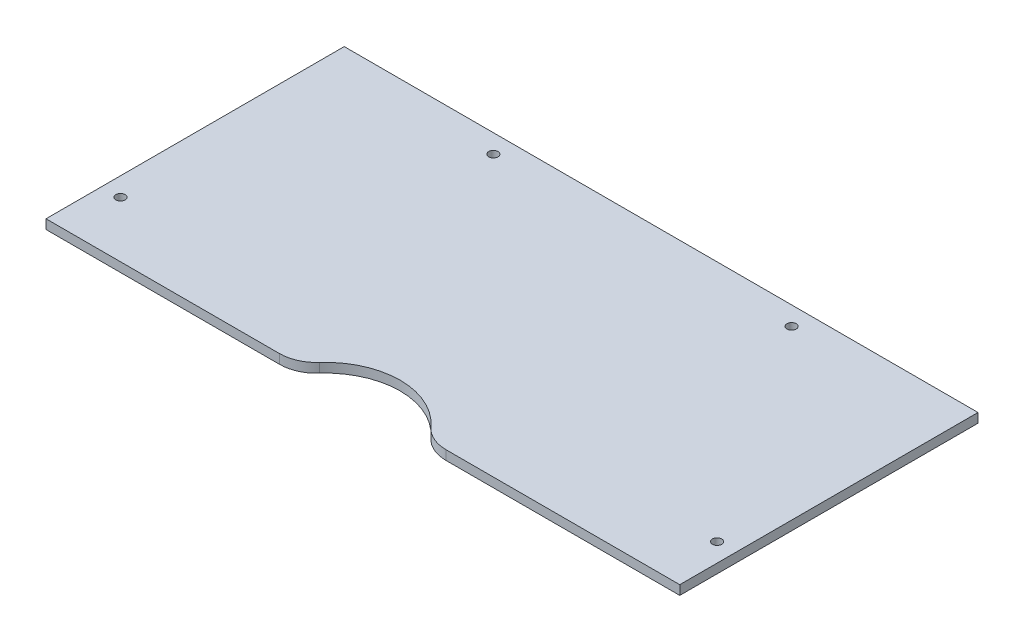
ISO-10303-21;
HEADER;
FILE_DESCRIPTION(('STEP AP214'),'2;1');
FILE_NAME('part.step','',(''),(''),'','','');
FILE_SCHEMA(('AUTOMOTIVE_DESIGN { 1 0 10303 214 1 1 1 1 }'));
ENDSEC;
DATA;
#1=APPLICATION_CONTEXT('core data for automotive mechanical design processes');
#2=APPLICATION_PROTOCOL_DEFINITION('international standard','automotive_design',2000,#1);
#3=PRODUCT_CONTEXT('',#1,'mechanical');
#4=PRODUCT('Part','Part','',(#3));
#5=PRODUCT_RELATED_PRODUCT_CATEGORY('part','',(#4));
#6=PRODUCT_DEFINITION_FORMATION('','',#4);
#7=PRODUCT_DEFINITION_CONTEXT('part definition',#1,'design');
#8=PRODUCT_DEFINITION('design','',#6,#7);
#9=PRODUCT_DEFINITION_SHAPE('','',#8);
#10=(LENGTH_UNIT() NAMED_UNIT(*) SI_UNIT(.MILLI.,.METRE.));
#11=(NAMED_UNIT(*) PLANE_ANGLE_UNIT() SI_UNIT($,.RADIAN.));
#12=(NAMED_UNIT(*) SI_UNIT($,.STERADIAN.) SOLID_ANGLE_UNIT());
#13=UNCERTAINTY_MEASURE_WITH_UNIT(LENGTH_MEASURE(1.E-05),#10,'distance_accuracy_value','');
#14=(GEOMETRIC_REPRESENTATION_CONTEXT(3) GLOBAL_UNCERTAINTY_ASSIGNED_CONTEXT((#13)) GLOBAL_UNIT_ASSIGNED_CONTEXT((#10,
#11,#12)) REPRESENTATION_CONTEXT('',''));
#15=CARTESIAN_POINT('',(0.,0.,0.));
#16=DIRECTION('',(0.,0.,1.));
#17=DIRECTION('',(1.,0.,0.));
#18=AXIS2_PLACEMENT_3D('',#15,#16,#17);
#19=CARTESIAN_POINT('',(107.95,3.175,-114.3));
#20=DIRECTION('',(0.,-1.,0.));
#21=DIRECTION('',(0.,0.,-1.));
#22=AXIS2_PLACEMENT_3D('',#19,#20,#21);
#23=CYLINDRICAL_SURFACE('',#22,25.4);
#24=CARTESIAN_POINT('',(107.95,0.,-114.3));
#25=DIRECTION('',(0.,1.,0.));
#26=DIRECTION('',(0.,0.,1.));
#27=AXIS2_PLACEMENT_3D('',#24,#25,#26);
#28=CIRCLE('',#27,25.4);
#29=CARTESIAN_POINT('',(126.882042209498,0.,-131.233333333333));
#30=VERTEX_POINT('',#29);
#31=CARTESIAN_POINT('',(89.0179577905017,0.,-131.233333333333));
#32=VERTEX_POINT('',#31);
#33=EDGE_CURVE('E158',#30,#32,#28,.T.);
#34=ORIENTED_EDGE('',*,*,#33,.F.);
#35=DIRECTION('',(0.,-1.,0.));
#36=VECTOR('',#35,1.);
#37=CARTESIAN_POINT('',(126.882042209498,3.175,-131.233333333333));
#38=LINE('',#37,#36);
#39=CARTESIAN_POINT('',(126.882042209498,3.175,-131.233333333333));
#40=VERTEX_POINT('',#39);
#41=EDGE_CURVE('E197',#30,#40,#38,.F.);
#42=ORIENTED_EDGE('',*,*,#41,.T.);
#43=CARTESIAN_POINT('',(107.95,3.175,-114.3));
#44=DIRECTION('',(0.,1.,0.));
#45=DIRECTION('',(0.,0.,1.));
#46=AXIS2_PLACEMENT_3D('',#43,#44,#45);
#47=CIRCLE('',#46,25.4);
#48=CARTESIAN_POINT('',(89.0179577905017,3.175,-131.233333333333));
#49=VERTEX_POINT('',#48);
#50=EDGE_CURVE('E141',#40,#49,#47,.T.);
#51=ORIENTED_EDGE('',*,*,#50,.T.);
#52=DIRECTION('',(0.,-1.,0.));
#53=VECTOR('',#52,1.);
#54=CARTESIAN_POINT('',(89.0179577905017,3.175,-131.233333333333));
#55=LINE('',#54,#53);
#56=EDGE_CURVE('E193',#49,#32,#55,.T.);
#57=ORIENTED_EDGE('',*,*,#56,.T.);
#58=EDGE_LOOP('',(#34,#42,#51,#57));
#59=FACE_BOUND('',#58,.T.);
#60=ADVANCED_FACE('F47',(#59),#23,.F.);
#61=CARTESIAN_POINT('',(0.,3.175,-127.));
#62=DIRECTION('',(0.,0.,1.));
#63=DIRECTION('',(1.,0.,0.));
#64=AXIS2_PLACEMENT_3D('',#61,#62,#63);
#65=PLANE('',#64);
#66=DIRECTION('',(-1.,0.,0.));
#67=VECTOR('',#66,1.);
#68=CARTESIAN_POINT('',(0.,3.175,-127.));
#69=LINE('',#68,#67);
#70=CARTESIAN_POINT('',(215.9,3.175,-127.));
#71=VERTEX_POINT('',#70);
#72=CARTESIAN_POINT('',(136.348063314247,3.175,-127.));
#73=VERTEX_POINT('',#72);
#74=EDGE_CURVE('E119',#71,#73,#69,.T.);
#75=ORIENTED_EDGE('',*,*,#74,.T.);
#76=DIRECTION('',(0.,-1.,0.));
#77=VECTOR('',#76,1.);
#78=CARTESIAN_POINT('',(136.348063314247,3.175,-127.));
#79=LINE('',#78,#77);
#80=CARTESIAN_POINT('',(136.348063314247,0.,-127.));
#81=VERTEX_POINT('',#80);
#82=EDGE_CURVE('E127',#73,#81,#79,.T.);
#83=ORIENTED_EDGE('',*,*,#82,.T.);
#84=DIRECTION('',(-1.,0.,0.));
#85=VECTOR('',#84,1.);
#86=CARTESIAN_POINT('',(0.,0.,-127.));
#87=LINE('',#86,#85);
#88=CARTESIAN_POINT('',(215.9,0.,-127.));
#89=VERTEX_POINT('',#88);
#90=EDGE_CURVE('E122',#89,#81,#87,.T.);
#91=ORIENTED_EDGE('',*,*,#90,.F.);
#92=DIRECTION('',(0.,-1.,0.));
#93=VECTOR('',#92,1.);
#94=CARTESIAN_POINT('',(215.9,3.175,-127.));
#95=LINE('',#94,#93);
#96=EDGE_CURVE('E114',#71,#89,#95,.T.);
#97=ORIENTED_EDGE('',*,*,#96,.F.);
#98=EDGE_LOOP('',(#75,#83,#91,#97));
#99=FACE_BOUND('',#98,.T.);
#100=ADVANCED_FACE('F116',(#99),#65,.T.);
#101=CARTESIAN_POINT('',(215.9,3.175,0.));
#102=DIRECTION('',(-1.,0.,0.));
#103=DIRECTION('',(0.,0.,1.));
#104=AXIS2_PLACEMENT_3D('',#101,#102,#103);
#105=PLANE('',#104);
#106=DIRECTION('',(0.,0.,-1.));
#107=VECTOR('',#106,1.);
#108=CARTESIAN_POINT('',(215.9,0.,0.));
#109=LINE('',#108,#107);
#110=CARTESIAN_POINT('',(215.9,0.,-228.6));
#111=VERTEX_POINT('',#110);
#112=EDGE_CURVE('E165',#89,#111,#109,.T.);
#113=ORIENTED_EDGE('',*,*,#112,.T.);
#114=DIRECTION('',(0.,-1.,0.));
#115=VECTOR('',#114,1.);
#116=CARTESIAN_POINT('',(215.9,3.175,-228.6));
#117=LINE('',#116,#115);
#118=CARTESIAN_POINT('',(215.9,3.175,-228.6));
#119=VERTEX_POINT('',#118);
#120=EDGE_CURVE('E128',#119,#111,#117,.T.);
#121=ORIENTED_EDGE('',*,*,#120,.F.);
#122=DIRECTION('',(0.,0.,-1.));
#123=VECTOR('',#122,1.);
#124=CARTESIAN_POINT('',(215.9,3.175,0.));
#125=LINE('',#124,#123);
#126=EDGE_CURVE('E131',#71,#119,#125,.T.);
#127=ORIENTED_EDGE('',*,*,#126,.F.);
#128=ORIENTED_EDGE('',*,*,#96,.T.);
#129=EDGE_LOOP('',(#113,#121,#127,#128));
#130=FACE_BOUND('',#129,.T.);
#131=ADVANCED_FACE('F132',(#130),#105,.F.);
#132=CARTESIAN_POINT('',(0.,3.175,-228.6));
#133=DIRECTION('',(0.,0.,-1.));
#134=DIRECTION('',(-1.,0.,0.));
#135=AXIS2_PLACEMENT_3D('',#132,#133,#134);
#136=PLANE('',#135);
#137=DIRECTION('',(1.,0.,0.));
#138=VECTOR('',#137,1.);
#139=CARTESIAN_POINT('',(0.,0.,-228.6));
#140=LINE('',#139,#138);
#141=CARTESIAN_POINT('',(0.,0.,-228.6));
#142=VERTEX_POINT('',#141);
#143=EDGE_CURVE('E168',#142,#111,#140,.T.);
#144=ORIENTED_EDGE('',*,*,#143,.F.);
#145=DIRECTION('',(0.,-1.,0.));
#146=VECTOR('',#145,1.);
#147=CARTESIAN_POINT('',(0.,3.175,-228.6));
#148=LINE('',#147,#146);
#149=CARTESIAN_POINT('',(0.,3.175,-228.6));
#150=VERTEX_POINT('',#149);
#151=EDGE_CURVE('E180',#150,#142,#148,.T.);
#152=ORIENTED_EDGE('',*,*,#151,.F.);
#153=DIRECTION('',(1.,0.,0.));
#154=VECTOR('',#153,1.);
#155=CARTESIAN_POINT('',(0.,3.175,-228.6));
#156=LINE('',#155,#154);
#157=EDGE_CURVE('E136',#150,#119,#156,.T.);
#158=ORIENTED_EDGE('',*,*,#157,.T.);
#159=ORIENTED_EDGE('',*,*,#120,.T.);
#160=EDGE_LOOP('',(#144,#152,#158,#159));
#161=FACE_BOUND('',#160,.T.);
#162=ADVANCED_FACE('F214',(#161),#136,.T.);
#163=CARTESIAN_POINT('',(0.,3.175,0.));
#164=DIRECTION('',(-1.,0.,0.));
#165=DIRECTION('',(0.,0.,1.));
#166=AXIS2_PLACEMENT_3D('',#163,#164,#165);
#167=PLANE('',#166);
#168=DIRECTION('',(0.,0.,-1.));
#169=VECTOR('',#168,1.);
#170=CARTESIAN_POINT('',(0.,0.,0.));
#171=LINE('',#170,#169);
#172=CARTESIAN_POINT('',(0.,0.,-127.));
#173=VERTEX_POINT('',#172);
#174=EDGE_CURVE('E172',#173,#142,#171,.T.);
#175=ORIENTED_EDGE('',*,*,#174,.F.);
#176=DIRECTION('',(0.,-1.,0.));
#177=VECTOR('',#176,1.);
#178=CARTESIAN_POINT('',(0.,3.175,-127.));
#179=LINE('',#178,#177);
#180=CARTESIAN_POINT('',(0.,3.175,-127.));
#181=VERTEX_POINT('',#180);
#182=EDGE_CURVE('E157',#181,#173,#179,.T.);
#183=ORIENTED_EDGE('',*,*,#182,.F.);
#184=DIRECTION('',(0.,0.,-1.));
#185=VECTOR('',#184,1.);
#186=CARTESIAN_POINT('',(0.,3.175,0.));
#187=LINE('',#186,#185);
#188=EDGE_CURVE('E150',#181,#150,#187,.T.);
#189=ORIENTED_EDGE('',*,*,#188,.T.);
#190=ORIENTED_EDGE('',*,*,#151,.T.);
#191=EDGE_LOOP('',(#175,#183,#189,#190));
#192=FACE_BOUND('',#191,.T.);
#193=ADVANCED_FACE('F217',(#192),#167,.T.);
#194=CARTESIAN_POINT('',(0.,3.175,-127.));
#195=DIRECTION('',(0.,0.,-1.));
#196=DIRECTION('',(-1.,0.,0.));
#197=AXIS2_PLACEMENT_3D('',#194,#195,#196);
#198=PLANE('',#197);
#199=DIRECTION('',(1.,0.,0.));
#200=VECTOR('',#199,1.);
#201=CARTESIAN_POINT('',(0.,0.,-127.));
#202=LINE('',#201,#200);
#203=CARTESIAN_POINT('',(79.5519366857526,0.,-127.));
#204=VERTEX_POINT('',#203);
#205=EDGE_CURVE('E144',#173,#204,#202,.T.);
#206=ORIENTED_EDGE('',*,*,#205,.T.);
#207=DIRECTION('',(0.,1.,0.));
#208=VECTOR('',#207,1.);
#209=CARTESIAN_POINT('',(79.5519366857526,3.175,-127.));
#210=LINE('',#209,#208);
#211=CARTESIAN_POINT('',(79.5519366857526,3.175,-127.));
#212=VERTEX_POINT('',#211);
#213=EDGE_CURVE('E11',#204,#212,#210,.T.);
#214=ORIENTED_EDGE('',*,*,#213,.T.);
#215=DIRECTION('',(1.,0.,0.));
#216=VECTOR('',#215,1.);
#217=CARTESIAN_POINT('',(0.,3.175,-127.));
#218=LINE('',#217,#216);
#219=EDGE_CURVE('E154',#181,#212,#218,.T.);
#220=ORIENTED_EDGE('',*,*,#219,.F.);
#221=ORIENTED_EDGE('',*,*,#182,.T.);
#222=EDGE_LOOP('',(#206,#214,#220,#221));
#223=FACE_BOUND('',#222,.T.);
#224=ADVANCED_FACE('F218',(#223),#198,.F.);
#225=CARTESIAN_POINT('',(0.,3.175,0.));
#226=DIRECTION('',(0.,1.,0.));
#227=DIRECTION('',(0.,0.,1.));
#228=AXIS2_PLACEMENT_3D('',#225,#226,#227);
#229=PLANE('',#228);
#230=CARTESIAN_POINT('',(6.35,3.175,-146.05));
#231=DIRECTION('',(0.,1.,0.));
#232=DIRECTION('',(0.,0.,1.));
#233=AXIS2_PLACEMENT_3D('',#230,#231,#232);
#234=CIRCLE('',#233,1.5875);
#235=CARTESIAN_POINT('',(6.35,3.175,-144.4625));
#236=VERTEX_POINT('',#235);
#237=EDGE_CURVE('E267',#236,#236,#234,.T.);
#238=ORIENTED_EDGE('',*,*,#237,.F.);
#239=EDGE_LOOP('',(#238));
#240=FACE_BOUND('',#239,.T.);
#241=CARTESIAN_POINT('',(57.15,3.175,-222.25));
#242=DIRECTION('',(0.,1.,0.));
#243=DIRECTION('',(0.,0.,1.));
#244=AXIS2_PLACEMENT_3D('',#241,#242,#243);
#245=CIRCLE('',#244,1.5875);
#246=CARTESIAN_POINT('',(57.15,3.175,-220.6625));
#247=VERTEX_POINT('',#246);
#248=EDGE_CURVE('E269',#247,#247,#245,.T.);
#249=ORIENTED_EDGE('',*,*,#248,.F.);
#250=EDGE_LOOP('',(#249));
#251=FACE_BOUND('',#250,.T.);
#252=CARTESIAN_POINT('',(158.75,3.175,-222.25));
#253=DIRECTION('',(0.,1.,0.));
#254=DIRECTION('',(0.,0.,1.));
#255=AXIS2_PLACEMENT_3D('',#252,#253,#254);
#256=CIRCLE('',#255,1.58749999999999);
#257=CARTESIAN_POINT('',(158.75,3.175,-220.6625));
#258=VERTEX_POINT('',#257);
#259=EDGE_CURVE('E281',#258,#258,#256,.T.);
#260=ORIENTED_EDGE('',*,*,#259,.F.);
#261=EDGE_LOOP('',(#260));
#262=FACE_BOUND('',#261,.T.);
#263=CARTESIAN_POINT('',(209.55,3.175,-146.05));
#264=DIRECTION('',(0.,1.,0.));
#265=DIRECTION('',(0.,0.,1.));
#266=AXIS2_PLACEMENT_3D('',#263,#264,#265);
#267=CIRCLE('',#266,1.58749999999999);
#268=CARTESIAN_POINT('',(209.55,3.175,-144.4625));
#269=VERTEX_POINT('',#268);
#270=EDGE_CURVE('E289',#269,#269,#267,.T.);
#271=ORIENTED_EDGE('',*,*,#270,.F.);
#272=EDGE_LOOP('',(#271));
#273=FACE_BOUND('',#272,.T.);
#274=ORIENTED_EDGE('',*,*,#50,.F.);
#275=CARTESIAN_POINT('',(136.348063314247,3.175,-139.7));
#276=DIRECTION('',(0.,1.,0.));
#277=DIRECTION('',(0.,0.,1.));
#278=AXIS2_PLACEMENT_3D('',#275,#276,#277);
#279=CIRCLE('',#278,12.7);
#280=EDGE_CURVE('E56',#40,#73,#279,.T.);
#281=ORIENTED_EDGE('',*,*,#280,.T.);
#282=ORIENTED_EDGE('',*,*,#74,.F.);
#283=ORIENTED_EDGE('',*,*,#126,.T.);
#284=ORIENTED_EDGE('',*,*,#157,.F.);
#285=ORIENTED_EDGE('',*,*,#188,.F.);
#286=ORIENTED_EDGE('',*,*,#219,.T.);
#287=CARTESIAN_POINT('',(79.5519366857526,3.175,-139.7));
#288=DIRECTION('',(0.,1.,0.));
#289=DIRECTION('',(0.,0.,1.));
#290=AXIS2_PLACEMENT_3D('',#287,#288,#289);
#291=CIRCLE('',#290,12.7);
#292=EDGE_CURVE('E68',#212,#49,#291,.T.);
#293=ORIENTED_EDGE('',*,*,#292,.T.);
#294=EDGE_LOOP('',(#274,#281,#282,#283,#284,#285,#286,#293));
#295=FACE_BOUND('',#294,.T.);
#296=ADVANCED_FACE('F138',(#240,#251,#262,#273,#295),#229,.T.);
#297=CARTESIAN_POINT('',(0.,0.,0.));
#298=DIRECTION('',(0.,1.,0.));
#299=DIRECTION('',(0.,0.,1.));
#300=AXIS2_PLACEMENT_3D('',#297,#298,#299);
#301=PLANE('',#300);
#302=CARTESIAN_POINT('',(6.35,0.,-146.05));
#303=DIRECTION('',(0.,1.,0.));
#304=DIRECTION('',(0.,0.,1.));
#305=AXIS2_PLACEMENT_3D('',#302,#303,#304);
#306=CIRCLE('',#305,1.5875);
#307=CARTESIAN_POINT('',(6.35,0.,-144.4625));
#308=VERTEX_POINT('',#307);
#309=EDGE_CURVE('E162',#308,#308,#306,.T.);
#310=ORIENTED_EDGE('',*,*,#309,.T.);
#311=EDGE_LOOP('',(#310));
#312=FACE_BOUND('',#311,.T.);
#313=CARTESIAN_POINT('',(57.15,0.,-222.25));
#314=DIRECTION('',(0.,1.,0.));
#315=DIRECTION('',(0.,0.,1.));
#316=AXIS2_PLACEMENT_3D('',#313,#314,#315);
#317=CIRCLE('',#316,1.5875);
#318=CARTESIAN_POINT('',(57.15,0.,-220.6625));
#319=VERTEX_POINT('',#318);
#320=EDGE_CURVE('E275',#319,#319,#317,.T.);
#321=ORIENTED_EDGE('',*,*,#320,.T.);
#322=EDGE_LOOP('',(#321));
#323=FACE_BOUND('',#322,.T.);
#324=CARTESIAN_POINT('',(158.75,0.,-222.25));
#325=DIRECTION('',(0.,1.,0.));
#326=DIRECTION('',(0.,0.,1.));
#327=AXIS2_PLACEMENT_3D('',#324,#325,#326);
#328=CIRCLE('',#327,1.58749999999999);
#329=CARTESIAN_POINT('',(158.75,0.,-220.6625));
#330=VERTEX_POINT('',#329);
#331=EDGE_CURVE('E285',#330,#330,#328,.T.);
#332=ORIENTED_EDGE('',*,*,#331,.T.);
#333=EDGE_LOOP('',(#332));
#334=FACE_BOUND('',#333,.T.);
#335=CARTESIAN_POINT('',(209.55,0.,-146.05));
#336=DIRECTION('',(0.,1.,0.));
#337=DIRECTION('',(0.,0.,1.));
#338=AXIS2_PLACEMENT_3D('',#335,#336,#337);
#339=CIRCLE('',#338,1.58749999999999);
#340=CARTESIAN_POINT('',(209.55,0.,-144.4625));
#341=VERTEX_POINT('',#340);
#342=EDGE_CURVE('E292',#341,#341,#339,.T.);
#343=ORIENTED_EDGE('',*,*,#342,.T.);
#344=EDGE_LOOP('',(#343));
#345=FACE_BOUND('',#344,.T.);
#346=ORIENTED_EDGE('',*,*,#90,.T.);
#347=CARTESIAN_POINT('',(136.348063314247,0.,-139.7));
#348=DIRECTION('',(0.,1.,0.));
#349=DIRECTION('',(0.,0.,1.));
#350=AXIS2_PLACEMENT_3D('',#347,#348,#349);
#351=CIRCLE('',#350,12.7);
#352=EDGE_CURVE('E190',#81,#30,#351,.F.);
#353=ORIENTED_EDGE('',*,*,#352,.T.);
#354=ORIENTED_EDGE('',*,*,#33,.T.);
#355=CARTESIAN_POINT('',(79.5519366857526,0.,-139.7));
#356=DIRECTION('',(0.,1.,0.));
#357=DIRECTION('',(0.,0.,1.));
#358=AXIS2_PLACEMENT_3D('',#355,#356,#357);
#359=CIRCLE('',#358,12.7);
#360=EDGE_CURVE('E187',#32,#204,#359,.F.);
#361=ORIENTED_EDGE('',*,*,#360,.T.);
#362=ORIENTED_EDGE('',*,*,#205,.F.);
#363=ORIENTED_EDGE('',*,*,#174,.T.);
#364=ORIENTED_EDGE('',*,*,#143,.T.);
#365=ORIENTED_EDGE('',*,*,#112,.F.);
#366=EDGE_LOOP('',(#346,#353,#354,#361,#362,#363,#364,#365));
#367=FACE_BOUND('',#366,.T.);
#368=ADVANCED_FACE('F209',(#312,#323,#334,#345,#367),#301,.F.);
#369=CARTESIAN_POINT('',(136.348063314247,3.175,-139.7));
#370=DIRECTION('',(0.,-1.,0.));
#371=DIRECTION('',(0.,0.,-1.));
#372=AXIS2_PLACEMENT_3D('',#369,#370,#371);
#373=CYLINDRICAL_SURFACE('',#372,12.7);
#374=ORIENTED_EDGE('',*,*,#280,.F.);
#375=ORIENTED_EDGE('',*,*,#41,.F.);
#376=ORIENTED_EDGE('',*,*,#352,.F.);
#377=ORIENTED_EDGE('',*,*,#82,.F.);
#378=EDGE_LOOP('',(#374,#375,#376,#377));
#379=FACE_BOUND('',#378,.T.);
#380=ADVANCED_FACE('F207',(#379),#373,.T.);
#381=CARTESIAN_POINT('',(79.5519366857526,3.175,-139.7));
#382=DIRECTION('',(0.,-1.,0.));
#383=DIRECTION('',(0.,0.,-1.));
#384=AXIS2_PLACEMENT_3D('',#381,#382,#383);
#385=CYLINDRICAL_SURFACE('',#384,12.7);
#386=ORIENTED_EDGE('',*,*,#292,.F.);
#387=ORIENTED_EDGE('',*,*,#213,.F.);
#388=ORIENTED_EDGE('',*,*,#360,.F.);
#389=ORIENTED_EDGE('',*,*,#56,.F.);
#390=EDGE_LOOP('',(#386,#387,#388,#389));
#391=FACE_BOUND('',#390,.T.);
#392=ADVANCED_FACE('F49',(#391),#385,.T.);
#393=CARTESIAN_POINT('',(209.55,0.,-146.05));
#394=DIRECTION('',(0.,1.,0.));
#395=DIRECTION('',(0.,0.,1.));
#396=AXIS2_PLACEMENT_3D('',#393,#394,#395);
#397=CYLINDRICAL_SURFACE('',#396,1.58749999999999);
#398=ORIENTED_EDGE('',*,*,#342,.F.);
#399=EDGE_LOOP('',(#398));
#400=FACE_BOUND('',#399,.T.);
#401=ORIENTED_EDGE('',*,*,#270,.T.);
#402=EDGE_LOOP('',(#401));
#403=FACE_BOUND('',#402,.T.);
#404=ADVANCED_FACE('F221',(#400,#403),#397,.F.);
#405=CARTESIAN_POINT('',(158.75,0.,-222.25));
#406=DIRECTION('',(0.,1.,0.));
#407=DIRECTION('',(0.,0.,1.));
#408=AXIS2_PLACEMENT_3D('',#405,#406,#407);
#409=CYLINDRICAL_SURFACE('',#408,1.58749999999999);
#410=ORIENTED_EDGE('',*,*,#331,.F.);
#411=EDGE_LOOP('',(#410));
#412=FACE_BOUND('',#411,.T.);
#413=ORIENTED_EDGE('',*,*,#259,.T.);
#414=EDGE_LOOP('',(#413));
#415=FACE_BOUND('',#414,.T.);
#416=ADVANCED_FACE('F227',(#412,#415),#409,.F.);
#417=CARTESIAN_POINT('',(57.15,0.,-222.25));
#418=DIRECTION('',(0.,1.,0.));
#419=DIRECTION('',(0.,0.,1.));
#420=AXIS2_PLACEMENT_3D('',#417,#418,#419);
#421=CYLINDRICAL_SURFACE('',#420,1.5875);
#422=ORIENTED_EDGE('',*,*,#320,.F.);
#423=EDGE_LOOP('',(#422));
#424=FACE_BOUND('',#423,.T.);
#425=ORIENTED_EDGE('',*,*,#248,.T.);
#426=EDGE_LOOP('',(#425));
#427=FACE_BOUND('',#426,.T.);
#428=ADVANCED_FACE('F252',(#424,#427),#421,.F.);
#429=CARTESIAN_POINT('',(6.35,0.,-146.05));
#430=DIRECTION('',(0.,1.,0.));
#431=DIRECTION('',(0.,0.,1.));
#432=AXIS2_PLACEMENT_3D('',#429,#430,#431);
#433=CYLINDRICAL_SURFACE('',#432,1.5875);
#434=ORIENTED_EDGE('',*,*,#309,.F.);
#435=EDGE_LOOP('',(#434));
#436=FACE_BOUND('',#435,.T.);
#437=ORIENTED_EDGE('',*,*,#237,.T.);
#438=EDGE_LOOP('',(#437));
#439=FACE_BOUND('',#438,.T.);
#440=ADVANCED_FACE('F256',(#436,#439),#433,.F.);
#441=CLOSED_SHELL('',(#60,#100,#131,#162,#193,#224,#296,#368,#380,#392,#404,#416,#428,#440));
#442=MANIFOLD_SOLID_BREP('B2',#441);
#443=ADVANCED_BREP_SHAPE_REPRESENTATION('',(#18,#442),#14);
#444=SHAPE_DEFINITION_REPRESENTATION(#9,#443);
ENDSEC;
END-ISO-10303-21;
